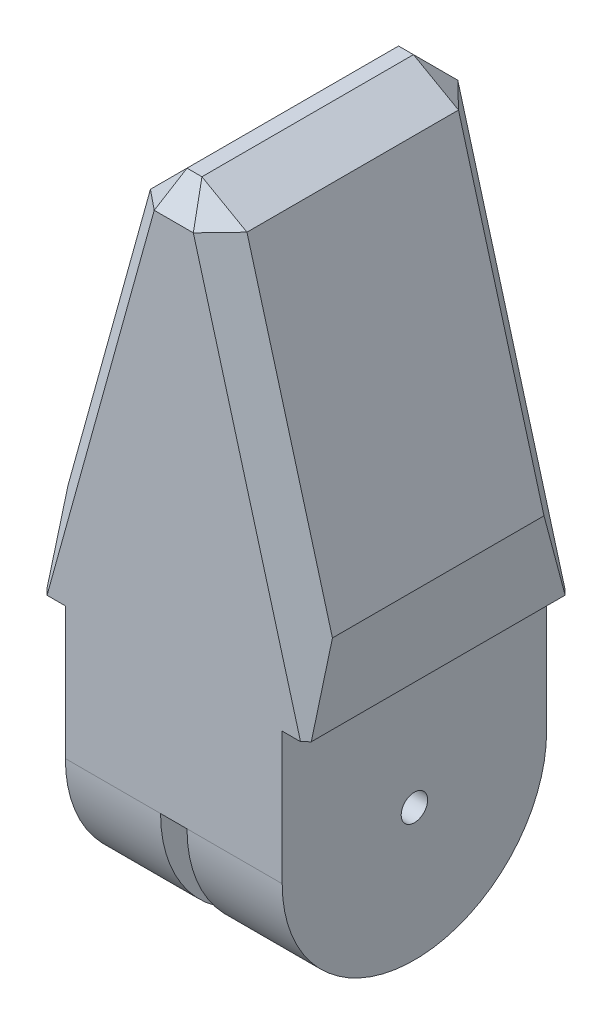
ISO-10303-21;
HEADER;
FILE_DESCRIPTION(('STEP AP214'),'2;1');
FILE_NAME('part.step','',(''),(''),'','','');
FILE_SCHEMA(('AUTOMOTIVE_DESIGN { 1 0 10303 214 1 1 1 1 }'));
ENDSEC;
DATA;
#1=APPLICATION_CONTEXT('core data for automotive mechanical design processes');
#2=APPLICATION_PROTOCOL_DEFINITION('international standard','automotive_design',2000,#1);
#3=PRODUCT_CONTEXT('',#1,'mechanical');
#4=PRODUCT('Part','Part','',(#3));
#5=PRODUCT_RELATED_PRODUCT_CATEGORY('part','',(#4));
#6=PRODUCT_DEFINITION_FORMATION('','',#4);
#7=PRODUCT_DEFINITION_CONTEXT('part definition',#1,'design');
#8=PRODUCT_DEFINITION('design','',#6,#7);
#9=PRODUCT_DEFINITION_SHAPE('','',#8);
#10=(LENGTH_UNIT() NAMED_UNIT(*) SI_UNIT(.MILLI.,.METRE.));
#11=(NAMED_UNIT(*) PLANE_ANGLE_UNIT() SI_UNIT($,.RADIAN.));
#12=(NAMED_UNIT(*) SI_UNIT($,.STERADIAN.) SOLID_ANGLE_UNIT());
#13=UNCERTAINTY_MEASURE_WITH_UNIT(LENGTH_MEASURE(1.E-05),#10,'distance_accuracy_value','');
#14=(GEOMETRIC_REPRESENTATION_CONTEXT(3) GLOBAL_UNCERTAINTY_ASSIGNED_CONTEXT((#13)) GLOBAL_UNIT_ASSIGNED_CONTEXT((#10,
#11,#12)) REPRESENTATION_CONTEXT('',''));
#15=CARTESIAN_POINT('',(0.,0.,0.));
#16=DIRECTION('',(0.,0.,1.));
#17=DIRECTION('',(1.,0.,0.));
#18=AXIS2_PLACEMENT_3D('',#15,#16,#17);
#19=CARTESIAN_POINT('',(-25.,25.,0.));
#20=DIRECTION('',(1.,0.,0.));
#21=DIRECTION('',(0.,0.,-1.));
#22=AXIS2_PLACEMENT_3D('',#19,#20,#21);
#23=CYLINDRICAL_SURFACE('',#22,25.);
#24=CARTESIAN_POINT('',(2.5,25.,0.));
#25=DIRECTION('',(-1.,0.,0.));
#26=DIRECTION('',(0.,0.,1.));
#27=AXIS2_PLACEMENT_3D('',#24,#25,#26);
#28=CIRCLE('',#27,25.);
#29=CARTESIAN_POINT('',(2.5,25.,-25.));
#30=VERTEX_POINT('',#29);
#31=CARTESIAN_POINT('',(2.5,25.,25.));
#32=VERTEX_POINT('',#31);
#33=EDGE_CURVE('E109',#30,#32,#28,.T.);
#34=ORIENTED_EDGE('',*,*,#33,.F.);
#35=DIRECTION('',(1.,0.,0.));
#36=VECTOR('',#35,1.);
#37=CARTESIAN_POINT('',(-25.,25.,-25.));
#38=LINE('',#37,#36);
#39=CARTESIAN_POINT('',(20.5,25.,-25.));
#40=VERTEX_POINT('',#39);
#41=EDGE_CURVE('E253',#30,#40,#38,.T.);
#42=ORIENTED_EDGE('',*,*,#41,.T.);
#43=CARTESIAN_POINT('',(20.5,25.,0.));
#44=DIRECTION('',(-1.,0.,0.));
#45=DIRECTION('',(0.,0.,1.));
#46=AXIS2_PLACEMENT_3D('',#43,#44,#45);
#47=CIRCLE('',#46,25.);
#48=CARTESIAN_POINT('',(20.5,25.,25.));
#49=VERTEX_POINT('',#48);
#50=EDGE_CURVE('E268',#40,#49,#47,.T.);
#51=ORIENTED_EDGE('',*,*,#50,.T.);
#52=DIRECTION('',(1.,0.,0.));
#53=VECTOR('',#52,1.);
#54=CARTESIAN_POINT('',(-25.,25.,25.));
#55=LINE('',#54,#53);
#56=EDGE_CURVE('E255',#32,#49,#55,.T.);
#57=ORIENTED_EDGE('',*,*,#56,.F.);
#58=EDGE_LOOP('',(#34,#42,#51,#57));
#59=FACE_BOUND('',#58,.T.);
#60=ADVANCED_FACE('F92',(#59),#23,.T.);
#61=CARTESIAN_POINT('',(-2.5,25.,0.));
#62=DIRECTION('',(1.,0.,0.));
#63=DIRECTION('',(0.,0.,-1.));
#64=AXIS2_PLACEMENT_3D('',#61,#62,#63);
#65=CIRCLE('',#64,25.);
#66=CARTESIAN_POINT('',(-2.5,25.,25.));
#67=VERTEX_POINT('',#66);
#68=CARTESIAN_POINT('',(-2.5,25.,-25.));
#69=VERTEX_POINT('',#68);
#70=EDGE_CURVE('E259',#67,#69,#65,.T.);
#71=ORIENTED_EDGE('',*,*,#70,.F.);
#72=CARTESIAN_POINT('',(-20.5,25.,25.));
#73=VERTEX_POINT('',#72);
#74=EDGE_CURVE('E276',#73,#67,#55,.T.);
#75=ORIENTED_EDGE('',*,*,#74,.F.);
#76=CARTESIAN_POINT('',(-20.5,25.,0.));
#77=DIRECTION('',(1.,0.,0.));
#78=DIRECTION('',(0.,0.,-1.));
#79=AXIS2_PLACEMENT_3D('',#76,#77,#78);
#80=CIRCLE('',#79,25.);
#81=CARTESIAN_POINT('',(-20.5,25.,-25.));
#82=VERTEX_POINT('',#81);
#83=EDGE_CURVE('E289',#73,#82,#80,.T.);
#84=ORIENTED_EDGE('',*,*,#83,.T.);
#85=EDGE_CURVE('E267',#82,#69,#38,.T.);
#86=ORIENTED_EDGE('',*,*,#85,.T.);
#87=EDGE_LOOP('',(#71,#75,#84,#86));
#88=FACE_BOUND('',#87,.T.);
#89=ADVANCED_FACE('F549',(#88),#23,.T.);
#90=CARTESIAN_POINT('',(-25.,25.,0.));
#91=DIRECTION('',(1.,0.,0.));
#92=DIRECTION('',(0.,0.,-1.));
#93=AXIS2_PLACEMENT_3D('',#90,#91,#92);
#94=CYLINDRICAL_SURFACE('',#93,2.5);
#95=CARTESIAN_POINT('',(-20.5,25.,0.));
#96=DIRECTION('',(1.,0.,0.));
#97=DIRECTION('',(0.,0.,-1.));
#98=AXIS2_PLACEMENT_3D('',#95,#96,#97);
#99=CIRCLE('',#98,2.5);
#100=CARTESIAN_POINT('',(-20.5,25.,-2.5));
#101=VERTEX_POINT('',#100);
#102=EDGE_CURVE('E285',#101,#101,#99,.T.);
#103=ORIENTED_EDGE('',*,*,#102,.F.);
#104=EDGE_LOOP('',(#103));
#105=FACE_BOUND('',#104,.T.);
#106=CARTESIAN_POINT('',(20.5,25.,0.));
#107=DIRECTION('',(-1.,0.,0.));
#108=DIRECTION('',(0.,0.,1.));
#109=AXIS2_PLACEMENT_3D('',#106,#107,#108);
#110=CIRCLE('',#109,2.5);
#111=CARTESIAN_POINT('',(20.5,25.,2.5));
#112=VERTEX_POINT('',#111);
#113=EDGE_CURVE('E272',#112,#112,#110,.T.);
#114=ORIENTED_EDGE('',*,*,#113,.F.);
#115=EDGE_LOOP('',(#114));
#116=FACE_BOUND('',#115,.T.);
#117=CARTESIAN_POINT('',(-2.5,25.,0.));
#118=DIRECTION('',(1.,0.,0.));
#119=DIRECTION('',(0.,0.,-1.));
#120=AXIS2_PLACEMENT_3D('',#117,#118,#119);
#121=CIRCLE('',#120,2.5);
#122=CARTESIAN_POINT('',(-2.5,25.,2.5));
#123=VERTEX_POINT('',#122);
#124=CARTESIAN_POINT('',(-2.5,25.,-2.5));
#125=VERTEX_POINT('',#124);
#126=EDGE_CURVE('E414',#123,#125,#121,.T.);
#127=ORIENTED_EDGE('',*,*,#126,.T.);
#128=DIRECTION('',(1.,0.,0.));
#129=VECTOR('',#128,1.);
#130=CARTESIAN_POINT('',(-25.,25.,-2.5));
#131=LINE('',#130,#129);
#132=CARTESIAN_POINT('',(2.5,25.,-2.5));
#133=VERTEX_POINT('',#132);
#134=EDGE_CURVE('E12',#125,#133,#131,.T.);
#135=ORIENTED_EDGE('',*,*,#134,.T.);
#136=CARTESIAN_POINT('',(2.5,25.,0.));
#137=DIRECTION('',(-1.,0.,0.));
#138=DIRECTION('',(0.,0.,1.));
#139=AXIS2_PLACEMENT_3D('',#136,#137,#138);
#140=CIRCLE('',#139,2.5);
#141=CARTESIAN_POINT('',(2.5,25.,2.5));
#142=VERTEX_POINT('',#141);
#143=EDGE_CURVE('E102',#133,#142,#140,.T.);
#144=ORIENTED_EDGE('',*,*,#143,.T.);
#145=DIRECTION('',(1.,0.,0.));
#146=VECTOR('',#145,1.);
#147=CARTESIAN_POINT('',(-25.,25.,2.5));
#148=LINE('',#147,#146);
#149=EDGE_CURVE('E364',#142,#123,#148,.F.);
#150=ORIENTED_EDGE('',*,*,#149,.T.);
#151=EDGE_LOOP('',(#127,#135,#144,#150));
#152=FACE_BOUND('',#151,.T.);
#153=ADVANCED_FACE('F419',(#105,#116,#152),#94,.F.);
#154=CARTESIAN_POINT('',(-25.,100.,25.));
#155=DIRECTION('',(1.,0.,0.));
#156=DIRECTION('',(0.,0.,-1.));
#157=AXIS2_PLACEMENT_3D('',#154,#155,#156);
#158=PLANE('',#157);
#159=DIRECTION('',(0.,0.,1.));
#160=VECTOR('',#159,1.);
#161=CARTESIAN_POINT('',(-25.,50.,25.));
#162=LINE('',#161,#160);
#163=CARTESIAN_POINT('',(-25.,50.,-24.0037563570609));
#164=VERTEX_POINT('',#163);
#165=CARTESIAN_POINT('',(-25.,50.,24.003756357061));
#166=VERTEX_POINT('',#165);
#167=EDGE_CURVE('E436',#164,#166,#162,.T.);
#168=ORIENTED_EDGE('',*,*,#167,.T.);
#169=DIRECTION('',(0.,0.966174675900876,-0.257888533377964));
#170=VECTOR('',#169,1.);
#171=CARTESIAN_POINT('',(-25.,14.648982557376,33.4395470780263));
#172=LINE('',#171,#170);
#173=CARTESIAN_POINT('',(-25.,65.,20.));
#174=VERTEX_POINT('',#173);
#175=EDGE_CURVE('E340',#166,#174,#172,.T.);
#176=ORIENTED_EDGE('',*,*,#175,.T.);
#177=DIRECTION('',(0.,0.,-1.));
#178=VECTOR('',#177,1.);
#179=CARTESIAN_POINT('',(-25.,65.,25.));
#180=LINE('',#179,#178);
#181=CARTESIAN_POINT('',(-25.,65.,-20.));
#182=VERTEX_POINT('',#181);
#183=EDGE_CURVE('E432',#174,#182,#180,.T.);
#184=ORIENTED_EDGE('',*,*,#183,.T.);
#185=DIRECTION('',(0.,-0.966174675900877,-0.257888533377962));
#186=VECTOR('',#185,1.);
#187=CARTESIAN_POINT('',(-25.,92.8528916031014,-12.5655872121036));
#188=LINE('',#187,#186);
#189=EDGE_CURVE('E337',#182,#164,#188,.T.);
#190=ORIENTED_EDGE('',*,*,#189,.T.);
#191=EDGE_LOOP('',(#168,#176,#184,#190));
#192=FACE_BOUND('',#191,.T.);
#193=ADVANCED_FACE('F533',(#192),#158,.F.);
#194=CARTESIAN_POINT('',(-25.,100.,25.));
#195=DIRECTION('',(0.,0.,-1.));
#196=DIRECTION('',(-1.,0.,0.));
#197=AXIS2_PLACEMENT_3D('',#194,#195,#196);
#198=PLANE('',#197);
#199=DIRECTION('',(-1.,0.,0.));
#200=VECTOR('',#199,1.);
#201=CARTESIAN_POINT('',(-7.49999999999999,123.184755793801,25.));
#202=LINE('',#201,#200);
#203=CARTESIAN_POINT('',(3.69659603944145,123.184755793801,25.));
#204=VERTEX_POINT('',#203);
#205=CARTESIAN_POINT('',(-3.69659603944145,123.184755793801,25.));
#206=VERTEX_POINT('',#205);
#207=EDGE_CURVE('E325',#204,#206,#202,.T.);
#208=ORIENTED_EDGE('',*,*,#207,.T.);
#209=DIRECTION('',(-0.266917090470731,-0.963719495919139,0.));
#210=VECTOR('',#209,1.);
#211=CARTESIAN_POINT('',(-20.1814025204043,63.6654145476464,25.));
#212=LINE('',#211,#210);
#213=CARTESIAN_POINT('',(-23.966251438144,50.,25.));
#214=VERTEX_POINT('',#213);
#215=EDGE_CURVE('E328',#206,#214,#212,.T.);
#216=ORIENTED_EDGE('',*,*,#215,.T.);
#217=DIRECTION('',(-1.,0.,0.));
#218=VECTOR('',#217,1.);
#219=CARTESIAN_POINT('',(-20.5,50.,25.));
#220=LINE('',#219,#218);
#221=CARTESIAN_POINT('',(-20.5,50.,25.));
#222=VERTEX_POINT('',#221);
#223=EDGE_CURVE('E451',#222,#214,#220,.T.);
#224=ORIENTED_EDGE('',*,*,#223,.F.);
#225=DIRECTION('',(0.,-1.,0.));
#226=VECTOR('',#225,1.);
#227=CARTESIAN_POINT('',(-20.5,0.,25.));
#228=LINE('',#227,#226);
#229=EDGE_CURVE('E440',#222,#73,#228,.T.);
#230=ORIENTED_EDGE('',*,*,#229,.T.);
#231=ORIENTED_EDGE('',*,*,#74,.T.);
#232=DIRECTION('',(1.,0.,0.));
#233=VECTOR('',#232,1.);
#234=CARTESIAN_POINT('',(-2.5,25.,25.));
#235=LINE('',#234,#233);
#236=EDGE_CURVE('E424',#67,#32,#235,.T.);
#237=ORIENTED_EDGE('',*,*,#236,.T.);
#238=ORIENTED_EDGE('',*,*,#56,.T.);
#239=DIRECTION('',(0.,-1.,0.));
#240=VECTOR('',#239,1.);
#241=CARTESIAN_POINT('',(20.5,0.,25.));
#242=LINE('',#241,#240);
#243=CARTESIAN_POINT('',(20.5,50.,25.));
#244=VERTEX_POINT('',#243);
#245=EDGE_CURVE('E463',#244,#49,#242,.T.);
#246=ORIENTED_EDGE('',*,*,#245,.F.);
#247=DIRECTION('',(1.,0.,0.));
#248=VECTOR('',#247,1.);
#249=CARTESIAN_POINT('',(20.5,50.,25.));
#250=LINE('',#249,#248);
#251=CARTESIAN_POINT('',(23.966251438144,50.,25.));
#252=VERTEX_POINT('',#251);
#253=EDGE_CURVE('E284',#244,#252,#250,.T.);
#254=ORIENTED_EDGE('',*,*,#253,.T.);
#255=DIRECTION('',(-0.266917090470731,0.963719495919139,0.));
#256=VECTOR('',#255,1.);
#257=CARTESIAN_POINT('',(7.61600372531335,109.033509080192,25.));
#258=LINE('',#257,#256);
#259=EDGE_CURVE('E322',#252,#204,#258,.T.);
#260=ORIENTED_EDGE('',*,*,#259,.T.);
#261=EDGE_LOOP('',(#208,#216,#224,#230,#231,#237,#238,#246,#254,#260));
#262=FACE_BOUND('',#261,.T.);
#263=ADVANCED_FACE('F519',(#262),#198,.F.);
#264=CARTESIAN_POINT('',(-25.,100.,-25.));
#265=DIRECTION('',(0.,0.,1.));
#266=DIRECTION('',(1.,0.,0.));
#267=AXIS2_PLACEMENT_3D('',#264,#265,#266);
#268=PLANE('',#267);
#269=DIRECTION('',(-1.,0.,0.));
#270=VECTOR('',#269,1.);
#271=CARTESIAN_POINT('',(-20.5,50.,-25.));
#272=LINE('',#271,#270);
#273=CARTESIAN_POINT('',(-20.5,50.,-25.));
#274=VERTEX_POINT('',#273);
#275=CARTESIAN_POINT('',(-23.9662514381439,50.,-25.));
#276=VERTEX_POINT('',#275);
#277=EDGE_CURVE('E290',#274,#276,#272,.T.);
#278=ORIENTED_EDGE('',*,*,#277,.T.);
#279=DIRECTION('',(0.266917090470731,0.963719495919139,0.));
#280=VECTOR('',#279,1.);
#281=CARTESIAN_POINT('',(-2.68140252040426,126.850170341447,-25.));
#282=LINE('',#281,#280);
#283=CARTESIAN_POINT('',(-3.69659603944141,123.184755793801,-25.));
#284=VERTEX_POINT('',#283);
#285=EDGE_CURVE('E361',#276,#284,#282,.T.);
#286=ORIENTED_EDGE('',*,*,#285,.T.);
#287=DIRECTION('',(1.,0.,0.));
#288=VECTOR('',#287,1.);
#289=CARTESIAN_POINT('',(7.49999999999999,123.184755793801,-25.));
#290=LINE('',#289,#288);
#291=CARTESIAN_POINT('',(3.69659603944142,123.184755793801,-25.));
#292=VERTEX_POINT('',#291);
#293=EDGE_CURVE('E358',#284,#292,#290,.T.);
#294=ORIENTED_EDGE('',*,*,#293,.T.);
#295=DIRECTION('',(0.266917090470731,-0.963719495919139,0.));
#296=VECTOR('',#295,1.);
#297=CARTESIAN_POINT('',(7.6160037253133,109.033509080192,-25.));
#298=LINE('',#297,#296);
#299=CARTESIAN_POINT('',(23.9662514381439,50.,-25.));
#300=VERTEX_POINT('',#299);
#301=EDGE_CURVE('E355',#292,#300,#298,.T.);
#302=ORIENTED_EDGE('',*,*,#301,.T.);
#303=DIRECTION('',(1.,0.,0.));
#304=VECTOR('',#303,1.);
#305=CARTESIAN_POINT('',(20.5,50.,-25.));
#306=LINE('',#305,#304);
#307=CARTESIAN_POINT('',(20.5,50.,-25.));
#308=VERTEX_POINT('',#307);
#309=EDGE_CURVE('E473',#308,#300,#306,.T.);
#310=ORIENTED_EDGE('',*,*,#309,.F.);
#311=DIRECTION('',(0.,1.,0.));
#312=VECTOR('',#311,1.);
#313=CARTESIAN_POINT('',(20.5,50.,-25.));
#314=LINE('',#313,#312);
#315=EDGE_CURVE('E265',#40,#308,#314,.T.);
#316=ORIENTED_EDGE('',*,*,#315,.F.);
#317=ORIENTED_EDGE('',*,*,#41,.F.);
#318=DIRECTION('',(-1.,0.,0.));
#319=VECTOR('',#318,1.);
#320=CARTESIAN_POINT('',(-2.5,25.,-25.));
#321=LINE('',#320,#319);
#322=EDGE_CURVE('E240',#30,#69,#321,.T.);
#323=ORIENTED_EDGE('',*,*,#322,.T.);
#324=ORIENTED_EDGE('',*,*,#85,.F.);
#325=DIRECTION('',(0.,1.,0.));
#326=VECTOR('',#325,1.);
#327=CARTESIAN_POINT('',(-20.5,50.,-25.));
#328=LINE('',#327,#326);
#329=EDGE_CURVE('E447',#82,#274,#328,.T.);
#330=ORIENTED_EDGE('',*,*,#329,.T.);
#331=EDGE_LOOP('',(#278,#286,#294,#302,#310,#316,#317,#323,#324,#330));
#332=FACE_BOUND('',#331,.T.);
#333=ADVANCED_FACE('F263',(#332),#268,.F.);
#334=CARTESIAN_POINT('',(25.,100.,25.));
#335=DIRECTION('',(-1.,0.,0.));
#336=DIRECTION('',(0.,0.,1.));
#337=AXIS2_PLACEMENT_3D('',#334,#335,#336);
#338=PLANE('',#337);
#339=DIRECTION('',(0.,0.,-1.));
#340=VECTOR('',#339,1.);
#341=CARTESIAN_POINT('',(25.,65.,25.));
#342=LINE('',#341,#340);
#343=CARTESIAN_POINT('',(25.,65.,20.));
#344=VERTEX_POINT('',#343);
#345=CARTESIAN_POINT('',(25.,65.,-20.));
#346=VERTEX_POINT('',#345);
#347=EDGE_CURVE('E410',#344,#346,#342,.T.);
#348=ORIENTED_EDGE('',*,*,#347,.F.);
#349=DIRECTION('',(0.,0.966174675900876,-0.257888533377964));
#350=VECTOR('',#349,1.);
#351=CARTESIAN_POINT('',(25.,104.859167849416,9.36090688904939));
#352=LINE('',#351,#350);
#353=CARTESIAN_POINT('',(25.,50.,24.003756357061));
#354=VERTEX_POINT('',#353);
#355=EDGE_CURVE('E346',#344,#354,#352,.F.);
#356=ORIENTED_EDGE('',*,*,#355,.T.);
#357=DIRECTION('',(0.,0.,1.));
#358=VECTOR('',#357,1.);
#359=CARTESIAN_POINT('',(25.,50.,25.));
#360=LINE('',#359,#358);
#361=CARTESIAN_POINT('',(25.,50.,-24.0037563570609));
#362=VERTEX_POINT('',#361);
#363=EDGE_CURVE('E462',#362,#354,#360,.T.);
#364=ORIENTED_EDGE('',*,*,#363,.F.);
#365=DIRECTION('',(0.,-0.966174675900877,-0.257888533377962));
#366=VECTOR('',#365,1.);
#367=CARTESIAN_POINT('',(25.,14.648982557376,-33.4395470780262));
#368=LINE('',#367,#366);
#369=EDGE_CURVE('E343',#362,#346,#368,.F.);
#370=ORIENTED_EDGE('',*,*,#369,.T.);
#371=EDGE_LOOP('',(#348,#356,#364,#370));
#372=FACE_BOUND('',#371,.T.);
#373=ADVANCED_FACE('F494',(#372),#338,.F.);
#374=CARTESIAN_POINT('',(20.5,0.,0.));
#375=DIRECTION('',(-1.,0.,0.));
#376=DIRECTION('',(0.,0.,1.));
#377=AXIS2_PLACEMENT_3D('',#374,#375,#376);
#378=PLANE('',#377);
#379=ORIENTED_EDGE('',*,*,#113,.T.);
#380=EDGE_LOOP('',(#379));
#381=FACE_BOUND('',#380,.T.);
#382=ORIENTED_EDGE('',*,*,#315,.T.);
#383=DIRECTION('',(0.,0.,1.));
#384=VECTOR('',#383,1.);
#385=CARTESIAN_POINT('',(20.5,50.,25.));
#386=LINE('',#385,#384);
#387=EDGE_CURVE('E469',#308,#244,#386,.T.);
#388=ORIENTED_EDGE('',*,*,#387,.T.);
#389=ORIENTED_EDGE('',*,*,#245,.T.);
#390=ORIENTED_EDGE('',*,*,#50,.F.);
#391=EDGE_LOOP('',(#382,#388,#389,#390));
#392=FACE_BOUND('',#391,.T.);
#393=ADVANCED_FACE('F568',(#381,#392),#378,.F.);
#394=CARTESIAN_POINT('',(20.5,50.,25.));
#395=DIRECTION('',(0.,1.,0.));
#396=DIRECTION('',(0.,0.,1.));
#397=AXIS2_PLACEMENT_3D('',#394,#395,#396);
#398=PLANE('',#397);
#399=ORIENTED_EDGE('',*,*,#363,.T.);
#400=DIRECTION('',(0.720047981881934,0.,-0.693924278136854));
#401=VECTOR('',#400,1.);
#402=CARTESIAN_POINT('',(15.4891532836263,50.,33.1695447603288));
#403=LINE('',#402,#401);
#404=EDGE_CURVE('E352',#354,#252,#403,.F.);
#405=ORIENTED_EDGE('',*,*,#404,.T.);
#406=ORIENTED_EDGE('',*,*,#253,.F.);
#407=ORIENTED_EDGE('',*,*,#387,.F.);
#408=ORIENTED_EDGE('',*,*,#309,.T.);
#409=DIRECTION('',(-0.720047981881938,0.,-0.69392427813685));
#410=VECTOR('',#409,1.);
#411=CARTESIAN_POINT('',(34.7459425279304,50.,-14.611401536787));
#412=LINE('',#411,#410);
#413=EDGE_CURVE('E349',#300,#362,#412,.F.);
#414=ORIENTED_EDGE('',*,*,#413,.T.);
#415=EDGE_LOOP('',(#399,#405,#406,#407,#408,#414));
#416=FACE_BOUND('',#415,.T.);
#417=ADVANCED_FACE('F484',(#416),#398,.F.);
#418=CARTESIAN_POINT('',(-20.5,0.,0.));
#419=DIRECTION('',(1.,0.,0.));
#420=DIRECTION('',(0.,0.,1.));
#421=AXIS2_PLACEMENT_3D('',#418,#419,#420);
#422=PLANE('',#421);
#423=ORIENTED_EDGE('',*,*,#102,.T.);
#424=EDGE_LOOP('',(#423));
#425=FACE_BOUND('',#424,.T.);
#426=ORIENTED_EDGE('',*,*,#229,.F.);
#427=DIRECTION('',(0.,0.,1.));
#428=VECTOR('',#427,1.);
#429=CARTESIAN_POINT('',(-20.5,50.,25.));
#430=LINE('',#429,#428);
#431=EDGE_CURVE('E444',#274,#222,#430,.T.);
#432=ORIENTED_EDGE('',*,*,#431,.F.);
#433=ORIENTED_EDGE('',*,*,#329,.F.);
#434=ORIENTED_EDGE('',*,*,#83,.F.);
#435=EDGE_LOOP('',(#426,#432,#433,#434));
#436=FACE_BOUND('',#435,.T.);
#437=ADVANCED_FACE('F546',(#425,#436),#422,.F.);
#438=CARTESIAN_POINT('',(-20.5,50.,25.));
#439=DIRECTION('',(0.,-1.,0.));
#440=DIRECTION('',(0.,0.,-1.));
#441=AXIS2_PLACEMENT_3D('',#438,#439,#440);
#442=PLANE('',#441);
#443=ORIENTED_EDGE('',*,*,#223,.T.);
#444=DIRECTION('',(-0.720047981881934,0.,-0.693924278136854));
#445=VECTOR('',#444,1.);
#446=CARTESIAN_POINT('',(-22.1691071877651,50.,26.7319429510691));
#447=LINE('',#446,#445);
#448=EDGE_CURVE('E334',#214,#166,#447,.T.);
#449=ORIENTED_EDGE('',*,*,#448,.T.);
#450=ORIENTED_EDGE('',*,*,#167,.F.);
#451=DIRECTION('',(0.720047981881938,0.,-0.69392427813685));
#452=VECTOR('',#451,1.);
#453=CARTESIAN_POINT('',(-47.152045990331,50.,-2.65539776168169));
#454=LINE('',#453,#452);
#455=EDGE_CURVE('E331',#164,#276,#454,.T.);
#456=ORIENTED_EDGE('',*,*,#455,.T.);
#457=ORIENTED_EDGE('',*,*,#277,.F.);
#458=ORIENTED_EDGE('',*,*,#431,.T.);
#459=EDGE_LOOP('',(#443,#449,#450,#456,#457,#458));
#460=FACE_BOUND('',#459,.T.);
#461=ADVANCED_FACE('F530',(#460),#442,.T.);
#462=CARTESIAN_POINT('',(-39.9390399226086,11.0617377540648,25.));
#463=DIRECTION('',(-0.963719495919139,0.266917090470731,0.));
#464=DIRECTION('',(-0.266917090470731,-0.963719495919139,0.));
#465=AXIS2_PLACEMENT_3D('',#462,#463,#464);
#466=PLANE('',#465);
#467=ORIENTED_EDGE('',*,*,#183,.F.);
#468=DIRECTION('',(0.266917090470731,0.963719495919139,0.));
#469=VECTOR('',#468,1.);
#470=CARTESIAN_POINT('',(-7.5,128.184755793801,20.));
#471=LINE('',#470,#469);
#472=CARTESIAN_POINT('',(-9.41529972043483,121.269456073366,20.));
#473=VERTEX_POINT('',#472);
#474=EDGE_CURVE('E297',#174,#473,#471,.T.);
#475=ORIENTED_EDGE('',*,*,#474,.T.);
#476=DIRECTION('',(0.,0.,-1.));
#477=VECTOR('',#476,1.);
#478=CARTESIAN_POINT('',(-9.41529972043483,121.269456073366,25.));
#479=LINE('',#478,#477);
#480=CARTESIAN_POINT('',(-9.41529972043483,121.269456073366,-20.));
#481=VERTEX_POINT('',#480);
#482=EDGE_CURVE('E293',#473,#481,#479,.T.);
#483=ORIENTED_EDGE('',*,*,#482,.T.);
#484=DIRECTION('',(-0.266917090470731,-0.963719495919139,0.));
#485=VECTOR('',#484,1.);
#486=CARTESIAN_POINT('',(-25.,65.,-20.));
#487=LINE('',#486,#485);
#488=EDGE_CURVE('E280',#481,#182,#487,.T.);
#489=ORIENTED_EDGE('',*,*,#488,.T.);
#490=EDGE_LOOP('',(#467,#475,#483,#489));
#491=FACE_BOUND('',#490,.T.);
#492=ADVANCED_FACE('F640',(#491),#466,.T.);
#493=CARTESIAN_POINT('',(39.9390399226086,11.0617377540648,25.));
#494=DIRECTION('',(-0.963719495919139,-0.266917090470731,0.));
#495=DIRECTION('',(0.266917090470731,-0.963719495919139,0.));
#496=AXIS2_PLACEMENT_3D('',#493,#494,#495);
#497=PLANE('',#496);
#498=DIRECTION('',(0.,0.,1.));
#499=VECTOR('',#498,1.);
#500=CARTESIAN_POINT('',(8.83458545235365,123.366158314205,25.));
#501=LINE('',#500,#499);
#502=CARTESIAN_POINT('',(8.83458545235365,123.366158314205,-20.));
#503=VERTEX_POINT('',#502);
#504=CARTESIAN_POINT('',(8.83458545235365,123.366158314205,20.));
#505=VERTEX_POINT('',#504);
#506=EDGE_CURVE('E316',#503,#505,#501,.T.);
#507=ORIENTED_EDGE('',*,*,#506,.T.);
#508=DIRECTION('',(0.266917090470731,-0.963719495919139,0.));
#509=VECTOR('',#508,1.);
#510=CARTESIAN_POINT('',(39.9390399226086,11.0617377540648,20.));
#511=LINE('',#510,#509);
#512=EDGE_CURVE('E319',#505,#344,#511,.T.);
#513=ORIENTED_EDGE('',*,*,#512,.T.);
#514=ORIENTED_EDGE('',*,*,#347,.T.);
#515=DIRECTION('',(-0.266917090470731,0.963719495919139,0.));
#516=VECTOR('',#515,1.);
#517=CARTESIAN_POINT('',(39.9390399226086,11.0617377540648,-20.));
#518=LINE('',#517,#516);
#519=EDGE_CURVE('E313',#346,#503,#518,.T.);
#520=ORIENTED_EDGE('',*,*,#519,.T.);
#521=EDGE_LOOP('',(#507,#513,#514,#520));
#522=FACE_BOUND('',#521,.T.);
#523=ADVANCED_FACE('F497',(#522),#497,.F.);
#524=CARTESIAN_POINT('',(0.,128.184755793801,25.));
#525=DIRECTION('',(0.,1.,0.));
#526=DIRECTION('',(0.,0.,1.));
#527=AXIS2_PLACEMENT_3D('',#524,#525,#526);
#528=PLANE('',#527);
#529=DIRECTION('',(0.,0.,1.));
#530=VECTOR('',#529,1.);
#531=CARTESIAN_POINT('',(-2.49999999999995,128.184755793801,25.));
#532=LINE('',#531,#530);
#533=CARTESIAN_POINT('',(-2.49999999999995,128.184755793801,-20.));
#534=VERTEX_POINT('',#533);
#535=CARTESIAN_POINT('',(-2.49999999999995,128.184755793801,20.));
#536=VERTEX_POINT('',#535);
#537=EDGE_CURVE('E306',#534,#536,#532,.T.);
#538=ORIENTED_EDGE('',*,*,#537,.T.);
#539=DIRECTION('',(1.,0.,0.));
#540=VECTOR('',#539,1.);
#541=CARTESIAN_POINT('',(7.49999999999999,128.184755793801,20.));
#542=LINE('',#541,#540);
#543=CARTESIAN_POINT('',(0.324364610534933,128.184755793801,20.));
#544=VERTEX_POINT('',#543);
#545=EDGE_CURVE('E310',#536,#544,#542,.T.);
#546=ORIENTED_EDGE('',*,*,#545,.T.);
#547=DIRECTION('',(0.,0.,-1.));
#548=VECTOR('',#547,1.);
#549=CARTESIAN_POINT('',(0.324364610534933,128.184755793801,-25.));
#550=LINE('',#549,#548);
#551=CARTESIAN_POINT('',(0.324364610534933,128.184755793801,-20.));
#552=VERTEX_POINT('',#551);
#553=EDGE_CURVE('E303',#544,#552,#550,.T.);
#554=ORIENTED_EDGE('',*,*,#553,.T.);
#555=DIRECTION('',(-1.,0.,0.));
#556=VECTOR('',#555,1.);
#557=CARTESIAN_POINT('',(-7.49999999999999,128.184755793801,-20.));
#558=LINE('',#557,#556);
#559=EDGE_CURVE('E300',#552,#534,#558,.T.);
#560=ORIENTED_EDGE('',*,*,#559,.T.);
#561=EDGE_LOOP('',(#538,#546,#554,#560));
#562=FACE_BOUND('',#561,.T.);
#563=ADVANCED_FACE('F631',(#562),#528,.T.);
#564=CARTESIAN_POINT('',(7.61600372531334,109.033509080192,25.));
#565=DIRECTION('',(-0.681452590726106,-0.188738884686437,-0.707106781186546));
#566=DIRECTION('',(-0.266917090470731,0.963719495919139,0.));
#567=AXIS2_PLACEMENT_3D('',#564,#565,#566);
#568=PLANE('',#567);
#569=ORIENTED_EDGE('',*,*,#355,.F.);
#570=ORIENTED_EDGE('',*,*,#512,.F.);
#571=DIRECTION('',(-0.716435612221217,-0.0252945686181653,0.697194519728627));
#572=VECTOR('',#571,1.);
#573=CARTESIAN_POINT('',(8.83458545235365,123.366158314205,20.));
#574=LINE('',#573,#572);
#575=EDGE_CURVE('E402',#204,#505,#574,.F.);
#576=ORIENTED_EDGE('',*,*,#575,.F.);
#577=ORIENTED_EDGE('',*,*,#259,.F.);
#578=ORIENTED_EDGE('',*,*,#404,.F.);
#579=EDGE_LOOP('',(#569,#570,#576,#577,#578));
#580=FACE_BOUND('',#579,.T.);
#581=ADVANCED_FACE('F95',(#580),#568,.F.);
#582=CARTESIAN_POINT('',(39.9390399226086,11.0617377540648,-20.));
#583=DIRECTION('',(-0.681452590726103,-0.188738884686436,0.70710678118655));
#584=DIRECTION('',(-0.266917090470731,0.963719495919139,0.));
#585=AXIS2_PLACEMENT_3D('',#582,#583,#584);
#586=PLANE('',#585);
#587=ORIENTED_EDGE('',*,*,#413,.F.);
#588=ORIENTED_EDGE('',*,*,#301,.F.);
#589=DIRECTION('',(0.71643561222122,0.0252945686181708,0.697194519728624));
#590=VECTOR('',#589,1.);
#591=CARTESIAN_POINT('',(4.55378169894081,123.215019701838,-24.1658355140386));
#592=LINE('',#591,#590);
#593=EDGE_CURVE('E398',#503,#292,#592,.F.);
#594=ORIENTED_EDGE('',*,*,#593,.F.);
#595=ORIENTED_EDGE('',*,*,#519,.F.);
#596=ORIENTED_EDGE('',*,*,#369,.F.);
#597=EDGE_LOOP('',(#587,#588,#594,#595,#596));
#598=FACE_BOUND('',#597,.T.);
#599=ADVANCED_FACE('F489',(#598),#586,.F.);
#600=CARTESIAN_POINT('',(0.324364610534933,128.184755793801,25.));
#601=DIRECTION('',(0.492713706039669,0.870191475412541,0.));
#602=DIRECTION('',(0.,0.,1.));
#603=AXIS2_PLACEMENT_3D('',#600,#601,#602);
#604=PLANE('',#603);
#605=DIRECTION('',(-0.870191475412541,0.492713706039669,0.));
#606=VECTOR('',#605,1.);
#607=CARTESIAN_POINT('',(8.83458545235365,123.366158314205,20.));
#608=LINE('',#607,#606);
#609=EDGE_CURVE('E406',#505,#544,#608,.T.);
#610=ORIENTED_EDGE('',*,*,#609,.F.);
#611=ORIENTED_EDGE('',*,*,#506,.F.);
#612=DIRECTION('',(0.870191475412541,-0.492713706039669,0.));
#613=VECTOR('',#612,1.);
#614=CARTESIAN_POINT('',(0.324364610534933,128.184755793801,-20.));
#615=LINE('',#614,#613);
#616=EDGE_CURVE('E394',#552,#503,#615,.T.);
#617=ORIENTED_EDGE('',*,*,#616,.F.);
#618=ORIENTED_EDGE('',*,*,#553,.F.);
#619=EDGE_LOOP('',(#610,#611,#617,#618));
#620=FACE_BOUND('',#619,.T.);
#621=ADVANCED_FACE('F508',(#620),#604,.T.);
#622=CARTESIAN_POINT('',(8.83458545235365,123.366158314205,20.));
#623=DIRECTION('',(0.433925010030468,0.766363590190879,0.473704478868212));
#624=DIRECTION('',(0.,-0.52578390477705,0.850618178431074));
#625=AXIS2_PLACEMENT_3D('',#622,#623,#624);
#626=PLANE('',#625);
#627=ORIENTED_EDGE('',*,*,#575,.T.);
#628=ORIENTED_EDGE('',*,*,#609,.T.);
#629=DIRECTION('',(0.430459630690463,-0.638241532002511,0.638241532002515));
#630=VECTOR('',#629,1.);
#631=CARTESIAN_POINT('',(3.22511823021437,123.883814887411,24.3009409063897));
#632=LINE('',#631,#630);
#633=EDGE_CURVE('E390',#204,#544,#632,.F.);
#634=ORIENTED_EDGE('',*,*,#633,.F.);
#635=EDGE_LOOP('',(#627,#628,#634));
#636=FACE_BOUND('',#635,.T.);
#637=ADVANCED_FACE('F511',(#636),#626,.T.);
#638=CARTESIAN_POINT('',(0.324364610534933,128.184755793801,-20.));
#639=DIRECTION('',(0.433925010030466,0.766363590190875,-0.47370447886822));
#640=DIRECTION('',(0.,0.525783904777059,0.850618178431069));
#641=AXIS2_PLACEMENT_3D('',#638,#639,#640);
#642=PLANE('',#641);
#643=ORIENTED_EDGE('',*,*,#616,.T.);
#644=ORIENTED_EDGE('',*,*,#593,.T.);
#645=DIRECTION('',(-0.430459630690459,0.638241532002516,0.638241532002513));
#646=VECTOR('',#645,1.);
#647=CARTESIAN_POINT('',(0.324364610534933,128.184755793801,-20.));
#648=LINE('',#647,#646);
#649=EDGE_CURVE('E386',#552,#292,#648,.F.);
#650=ORIENTED_EDGE('',*,*,#649,.F.);
#651=EDGE_LOOP('',(#643,#644,#650));
#652=FACE_BOUND('',#651,.T.);
#653=ADVANCED_FACE('F611',(#652),#642,.T.);
#654=CARTESIAN_POINT('',(0.,128.184755793801,20.));
#655=DIRECTION('',(0.,0.707106781186549,0.707106781186545));
#656=DIRECTION('',(-1.,0.,0.));
#657=AXIS2_PLACEMENT_3D('',#654,#655,#656);
#658=PLANE('',#657);
#659=ORIENTED_EDGE('',*,*,#633,.T.);
#660=ORIENTED_EDGE('',*,*,#545,.F.);
#661=DIRECTION('',(0.166852040205518,0.697194519728623,-0.697194519728627));
#662=VECTOR('',#661,1.);
#663=CARTESIAN_POINT('',(-2.49999999999995,128.184755793801,20.));
#664=LINE('',#663,#662);
#665=EDGE_CURVE('E382',#206,#536,#664,.T.);
#666=ORIENTED_EDGE('',*,*,#665,.F.);
#667=ORIENTED_EDGE('',*,*,#207,.F.);
#668=EDGE_LOOP('',(#659,#660,#666,#667));
#669=FACE_BOUND('',#668,.T.);
#670=ADVANCED_FACE('F516',(#669),#658,.T.);
#671=CARTESIAN_POINT('',(-39.9390399226086,11.0617377540648,20.));
#672=DIRECTION('',(-0.681452590726106,0.188738884686437,0.707106781186546));
#673=DIRECTION('',(-0.266917090470731,-0.963719495919139,0.));
#674=AXIS2_PLACEMENT_3D('',#671,#672,#673);
#675=PLANE('',#674);
#676=ORIENTED_EDGE('',*,*,#448,.F.);
#677=ORIENTED_EDGE('',*,*,#215,.F.);
#678=DIRECTION('',(0.729982839685123,0.244484765562862,0.638241532002514));
#679=VECTOR('',#678,1.);
#680=CARTESIAN_POINT('',(-4.4961384018136,122.916974256489,24.3009409063898));
#681=LINE('',#680,#679);
#682=EDGE_CURVE('E378',#473,#206,#681,.T.);
#683=ORIENTED_EDGE('',*,*,#682,.F.);
#684=ORIENTED_EDGE('',*,*,#474,.F.);
#685=ORIENTED_EDGE('',*,*,#175,.F.);
#686=EDGE_LOOP('',(#676,#677,#683,#684,#685));
#687=FACE_BOUND('',#686,.T.);
#688=ADVANCED_FACE('F524',(#687),#675,.T.);
#689=CARTESIAN_POINT('',(-11.1782403845813,96.1718488861587,-25.));
#690=DIRECTION('',(-0.681452590726102,0.188738884686436,-0.70710678118655));
#691=DIRECTION('',(-0.266917090470731,-0.963719495919139,0.));
#692=AXIS2_PLACEMENT_3D('',#689,#690,#691);
#693=PLANE('',#692);
#694=ORIENTED_EDGE('',*,*,#189,.F.);
#695=ORIENTED_EDGE('',*,*,#488,.F.);
#696=DIRECTION('',(-0.729982839685127,-0.244484765562856,0.638241532002512));
#697=VECTOR('',#696,1.);
#698=CARTESIAN_POINT('',(-9.41529972043483,121.269456073366,-20.));
#699=LINE('',#698,#697);
#700=EDGE_CURVE('E374',#284,#481,#699,.T.);
#701=ORIENTED_EDGE('',*,*,#700,.F.);
#702=ORIENTED_EDGE('',*,*,#285,.F.);
#703=ORIENTED_EDGE('',*,*,#455,.F.);
#704=EDGE_LOOP('',(#694,#695,#701,#702,#703));
#705=FACE_BOUND('',#704,.T.);
#706=ADVANCED_FACE('F538',(#705),#693,.T.);
#707=CARTESIAN_POINT('',(-25.,123.184755793801,-25.));
#708=DIRECTION('',(0.,0.707106781186545,-0.707106781186549));
#709=DIRECTION('',(-1.,0.,0.));
#710=AXIS2_PLACEMENT_3D('',#707,#708,#709);
#711=PLANE('',#710);
#712=ORIENTED_EDGE('',*,*,#649,.T.);
#713=ORIENTED_EDGE('',*,*,#293,.F.);
#714=DIRECTION('',(-0.166852040205512,-0.697194519728628,-0.697194519728624));
#715=VECTOR('',#714,1.);
#716=CARTESIAN_POINT('',(-3.49696445541259,124.018920279762,-24.1658355140386));
#717=LINE('',#716,#715);
#718=EDGE_CURVE('E370',#534,#284,#717,.T.);
#719=ORIENTED_EDGE('',*,*,#718,.F.);
#720=ORIENTED_EDGE('',*,*,#559,.F.);
#721=EDGE_LOOP('',(#712,#713,#719,#720));
#722=FACE_BOUND('',#721,.T.);
#723=ADVANCED_FACE('F588',(#722),#711,.T.);
#724=CARTESIAN_POINT('',(-2.49999999999995,128.184755793801,20.));
#725=DIRECTION('',(-0.62273753166972,0.622737531669725,0.47370447886821));
#726=DIRECTION('',(-0.70710678118655,-0.707106781186545,0.));
#727=AXIS2_PLACEMENT_3D('',#724,#725,#726);
#728=PLANE('',#727);
#729=ORIENTED_EDGE('',*,*,#682,.T.);
#730=ORIENTED_EDGE('',*,*,#665,.T.);
#731=DIRECTION('',(0.70710678118655,0.707106781186545,0.));
#732=VECTOR('',#731,1.);
#733=CARTESIAN_POINT('',(-2.49999999999995,128.184755793801,20.));
#734=LINE('',#733,#732);
#735=EDGE_CURVE('E367',#473,#536,#734,.T.);
#736=ORIENTED_EDGE('',*,*,#735,.F.);
#737=EDGE_LOOP('',(#729,#730,#736));
#738=FACE_BOUND('',#737,.T.);
#739=ADVANCED_FACE('F582',(#738),#728,.T.);
#740=CARTESIAN_POINT('',(-9.41529972043483,121.269456073366,-20.));
#741=DIRECTION('',(-0.622737531669717,0.622737531669722,-0.473704478868218));
#742=DIRECTION('',(-0.70710678118655,-0.707106781186545,0.));
#743=AXIS2_PLACEMENT_3D('',#740,#741,#742);
#744=PLANE('',#743);
#745=ORIENTED_EDGE('',*,*,#718,.T.);
#746=ORIENTED_EDGE('',*,*,#700,.T.);
#747=DIRECTION('',(-0.70710678118655,-0.707106781186545,0.));
#748=VECTOR('',#747,1.);
#749=CARTESIAN_POINT('',(-9.41529972043483,121.269456073366,-20.));
#750=LINE('',#749,#748);
#751=EDGE_CURVE('E258',#534,#481,#750,.T.);
#752=ORIENTED_EDGE('',*,*,#751,.F.);
#753=EDGE_LOOP('',(#745,#746,#752));
#754=FACE_BOUND('',#753,.T.);
#755=ADVANCED_FACE('F576',(#754),#744,.T.);
#756=CARTESIAN_POINT('',(-9.41529972043483,121.269456073366,25.));
#757=DIRECTION('',(0.707106781186545,-0.70710678118655,0.));
#758=DIRECTION('',(0.,0.,-1.));
#759=AXIS2_PLACEMENT_3D('',#756,#757,#758);
#760=PLANE('',#759);
#761=ORIENTED_EDGE('',*,*,#735,.T.);
#762=ORIENTED_EDGE('',*,*,#537,.F.);
#763=ORIENTED_EDGE('',*,*,#751,.T.);
#764=ORIENTED_EDGE('',*,*,#482,.F.);
#765=EDGE_LOOP('',(#761,#762,#763,#764));
#766=FACE_BOUND('',#765,.T.);
#767=ADVANCED_FACE('F570',(#766),#760,.F.);
#768=CARTESIAN_POINT('',(2.5,25.,25.));
#769=DIRECTION('',(-1.,0.,0.));
#770=DIRECTION('',(0.,0.,1.));
#771=AXIS2_PLACEMENT_3D('',#768,#769,#770);
#772=PLANE('',#771);
#773=ORIENTED_EDGE('',*,*,#33,.T.);
#774=DIRECTION('',(0.,0.,-1.));
#775=VECTOR('',#774,1.);
#776=CARTESIAN_POINT('',(2.5,25.,25.));
#777=LINE('',#776,#775);
#778=EDGE_CURVE('E236',#32,#142,#777,.T.);
#779=ORIENTED_EDGE('',*,*,#778,.T.);
#780=ORIENTED_EDGE('',*,*,#143,.F.);
#781=EDGE_CURVE('E230',#133,#30,#777,.T.);
#782=ORIENTED_EDGE('',*,*,#781,.T.);
#783=EDGE_LOOP('',(#773,#779,#780,#782));
#784=FACE_BOUND('',#783,.T.);
#785=ADVANCED_FACE('F232',(#784),#772,.T.);
#786=CARTESIAN_POINT('',(-2.5,25.,25.));
#787=DIRECTION('',(1.,0.,0.));
#788=DIRECTION('',(0.,0.,-1.));
#789=AXIS2_PLACEMENT_3D('',#786,#787,#788);
#790=PLANE('',#789);
#791=ORIENTED_EDGE('',*,*,#70,.T.);
#792=DIRECTION('',(0.,0.,1.));
#793=VECTOR('',#792,1.);
#794=CARTESIAN_POINT('',(-2.5,25.,25.));
#795=LINE('',#794,#793);
#796=EDGE_CURVE('E243',#69,#125,#795,.T.);
#797=ORIENTED_EDGE('',*,*,#796,.T.);
#798=ORIENTED_EDGE('',*,*,#126,.F.);
#799=EDGE_CURVE('E117',#123,#67,#795,.T.);
#800=ORIENTED_EDGE('',*,*,#799,.T.);
#801=EDGE_LOOP('',(#791,#797,#798,#800));
#802=FACE_BOUND('',#801,.T.);
#803=ADVANCED_FACE('F421',(#802),#790,.T.);
#804=CARTESIAN_POINT('',(0.,25.,0.));
#805=DIRECTION('',(0.,-1.,0.));
#806=DIRECTION('',(0.,0.,-1.));
#807=AXIS2_PLACEMENT_3D('',#804,#805,#806);
#808=PLANE('',#807);
#809=ORIENTED_EDGE('',*,*,#796,.F.);
#810=ORIENTED_EDGE('',*,*,#322,.F.);
#811=ORIENTED_EDGE('',*,*,#781,.F.);
#812=ORIENTED_EDGE('',*,*,#134,.F.);
#813=EDGE_LOOP('',(#809,#810,#811,#812));
#814=FACE_BOUND('',#813,.T.);
#815=ADVANCED_FACE('F241',(#814),#808,.T.);
#816=ORIENTED_EDGE('',*,*,#778,.F.);
#817=ORIENTED_EDGE('',*,*,#236,.F.);
#818=ORIENTED_EDGE('',*,*,#799,.F.);
#819=ORIENTED_EDGE('',*,*,#149,.F.);
#820=EDGE_LOOP('',(#816,#817,#818,#819));
#821=FACE_BOUND('',#820,.T.);
#822=ADVANCED_FACE('F782',(#821),#808,.T.);
#823=CLOSED_SHELL('',(#60,#89,#153,#193,#263,#333,#373,#393,#417,#437,#461,#492,#523,#563,#581,
#599,#621,#637,#653,#670,#688,#706,#723,#739,#755,#767,#785,#803,#815,#822));
#824=MANIFOLD_SOLID_BREP('B2',#823);
#825=ADVANCED_BREP_SHAPE_REPRESENTATION('',(#18,#824),#14);
#826=SHAPE_DEFINITION_REPRESENTATION(#9,#825);
ENDSEC;
END-ISO-10303-21;
